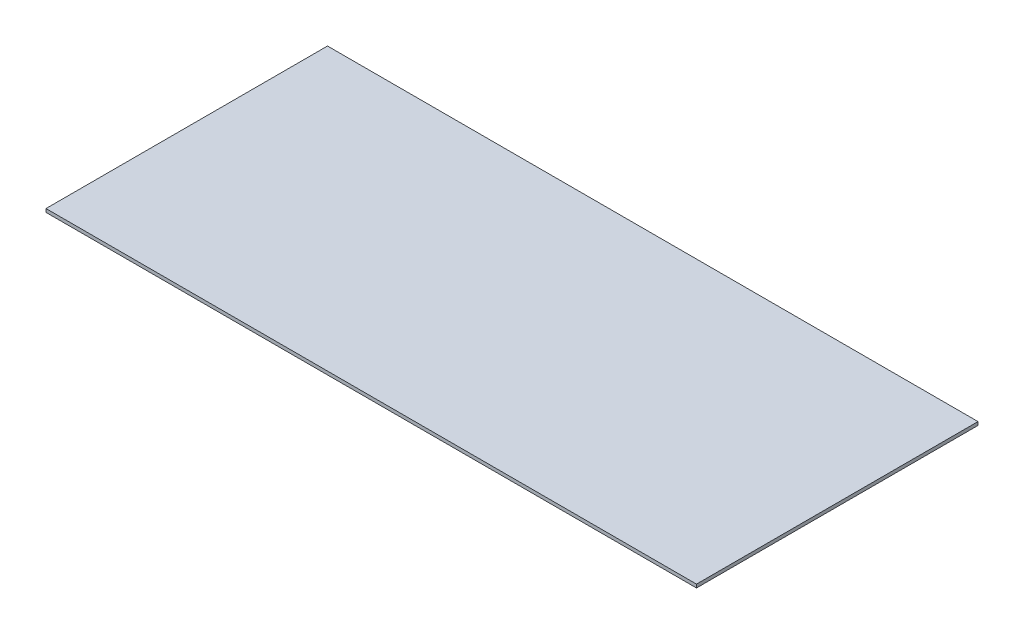
ISO-10303-21;
HEADER;
FILE_DESCRIPTION(('STEP AP214'),'2;1');
FILE_NAME('part.step','',(''),(''),'','','');
FILE_SCHEMA(('AUTOMOTIVE_DESIGN { 1 0 10303 214 1 1 1 1 }'));
ENDSEC;
DATA;
#1=APPLICATION_CONTEXT('core data for automotive mechanical design processes');
#2=APPLICATION_PROTOCOL_DEFINITION('international standard','automotive_design',2000,#1);
#3=PRODUCT_CONTEXT('',#1,'mechanical');
#4=PRODUCT('Part','Part','',(#3));
#5=PRODUCT_RELATED_PRODUCT_CATEGORY('part','',(#4));
#6=PRODUCT_DEFINITION_FORMATION('','',#4);
#7=PRODUCT_DEFINITION_CONTEXT('part definition',#1,'design');
#8=PRODUCT_DEFINITION('design','',#6,#7);
#9=PRODUCT_DEFINITION_SHAPE('','',#8);
#10=(LENGTH_UNIT() NAMED_UNIT(*) SI_UNIT(.MILLI.,.METRE.));
#11=(NAMED_UNIT(*) PLANE_ANGLE_UNIT() SI_UNIT($,.RADIAN.));
#12=(NAMED_UNIT(*) SI_UNIT($,.STERADIAN.) SOLID_ANGLE_UNIT());
#13=UNCERTAINTY_MEASURE_WITH_UNIT(LENGTH_MEASURE(1.E-05),#10,'distance_accuracy_value','');
#14=(GEOMETRIC_REPRESENTATION_CONTEXT(3) GLOBAL_UNCERTAINTY_ASSIGNED_CONTEXT((#13)) GLOBAL_UNIT_ASSIGNED_CONTEXT((#10,
#11,#12)) REPRESENTATION_CONTEXT('',''));
#15=CARTESIAN_POINT('',(0.,0.,0.));
#16=DIRECTION('',(0.,0.,1.));
#17=DIRECTION('',(1.,0.,0.));
#18=AXIS2_PLACEMENT_3D('',#15,#16,#17);
#19=CARTESIAN_POINT('',(1155.4,-0.00999999999999959,0.));
#20=DIRECTION('',(1.,0.,0.));
#21=DIRECTION('',(0.,0.,-1.));
#22=AXIS2_PLACEMENT_3D('',#19,#20,#21);
#23=PLANE('',#22);
#24=DIRECTION('',(0.,-1.,0.));
#25=VECTOR('',#24,1.);
#26=CARTESIAN_POINT('',(1155.4,6.,0.));
#27=LINE('',#26,#25);
#28=CARTESIAN_POINT('',(1155.4,6.,0.));
#29=VERTEX_POINT('',#28);
#30=CARTESIAN_POINT('',(1155.4,0.,0.));
#31=VERTEX_POINT('',#30);
#32=EDGE_CURVE('E86',#29,#31,#27,.T.);
#33=ORIENTED_EDGE('',*,*,#32,.T.);
#34=DIRECTION('',(0.,0.,-1.));
#35=VECTOR('',#34,1.);
#36=CARTESIAN_POINT('',(1155.4,0.,0.));
#37=LINE('',#36,#35);
#38=CARTESIAN_POINT('',(1155.4,0.,-500.));
#39=VERTEX_POINT('',#38);
#40=EDGE_CURVE('E79',#31,#39,#37,.T.);
#41=ORIENTED_EDGE('',*,*,#40,.T.);
#42=DIRECTION('',(0.,-1.,0.));
#43=VECTOR('',#42,1.);
#44=CARTESIAN_POINT('',(1155.4,6.,-500.));
#45=LINE('',#44,#43);
#46=CARTESIAN_POINT('',(1155.4,6.,-500.));
#47=VERTEX_POINT('',#46);
#48=EDGE_CURVE('E82',#47,#39,#45,.T.);
#49=ORIENTED_EDGE('',*,*,#48,.F.);
#50=DIRECTION('',(0.,0.,-1.));
#51=VECTOR('',#50,1.);
#52=CARTESIAN_POINT('',(1155.4,6.,0.));
#53=LINE('',#52,#51);
#54=EDGE_CURVE('E67',#29,#47,#53,.T.);
#55=ORIENTED_EDGE('',*,*,#54,.F.);
#56=EDGE_LOOP('',(#33,#41,#49,#55));
#57=FACE_BOUND('',#56,.T.);
#58=ADVANCED_FACE('F32',(#57),#23,.T.);
#59=CARTESIAN_POINT('',(0.,6.,0.));
#60=DIRECTION('',(0.,1.,0.));
#61=DIRECTION('',(0.,0.,1.));
#62=AXIS2_PLACEMENT_3D('',#59,#60,#61);
#63=PLANE('',#62);
#64=DIRECTION('',(1.,0.,0.));
#65=VECTOR('',#64,1.);
#66=CARTESIAN_POINT('',(0.,6.,0.));
#67=LINE('',#66,#65);
#68=CARTESIAN_POINT('',(0.,6.,0.));
#69=VERTEX_POINT('',#68);
#70=EDGE_CURVE('E93',#69,#29,#67,.T.);
#71=ORIENTED_EDGE('',*,*,#70,.T.);
#72=ORIENTED_EDGE('',*,*,#54,.T.);
#73=DIRECTION('',(1.,0.,0.));
#74=VECTOR('',#73,1.);
#75=CARTESIAN_POINT('',(0.,6.,-500.));
#76=LINE('',#75,#74);
#77=CARTESIAN_POINT('',(0.,6.,-500.));
#78=VERTEX_POINT('',#77);
#79=EDGE_CURVE('E84',#78,#47,#76,.T.);
#80=ORIENTED_EDGE('',*,*,#79,.F.);
#81=DIRECTION('',(0.,0.,-1.));
#82=VECTOR('',#81,1.);
#83=CARTESIAN_POINT('',(0.,6.,0.));
#84=LINE('',#83,#82);
#85=EDGE_CURVE('E95',#69,#78,#84,.T.);
#86=ORIENTED_EDGE('',*,*,#85,.F.);
#87=EDGE_LOOP('',(#71,#72,#80,#86));
#88=FACE_BOUND('',#87,.T.);
#89=ADVANCED_FACE('F105',(#88),#63,.T.);
#90=CARTESIAN_POINT('',(0.,6.,-500.));
#91=DIRECTION('',(0.,0.,-1.));
#92=DIRECTION('',(-1.,0.,0.));
#93=AXIS2_PLACEMENT_3D('',#90,#91,#92);
#94=PLANE('',#93);
#95=ORIENTED_EDGE('',*,*,#79,.T.);
#96=ORIENTED_EDGE('',*,*,#48,.T.);
#97=DIRECTION('',(1.,0.,0.));
#98=VECTOR('',#97,1.);
#99=CARTESIAN_POINT('',(0.,0.,-500.));
#100=LINE('',#99,#98);
#101=CARTESIAN_POINT('',(0.,0.,-500.));
#102=VERTEX_POINT('',#101);
#103=EDGE_CURVE('E11',#102,#39,#100,.T.);
#104=ORIENTED_EDGE('',*,*,#103,.F.);
#105=DIRECTION('',(0.,-1.,0.));
#106=VECTOR('',#105,1.);
#107=CARTESIAN_POINT('',(0.,6.,-500.));
#108=LINE('',#107,#106);
#109=EDGE_CURVE('E60',#78,#102,#108,.T.);
#110=ORIENTED_EDGE('',*,*,#109,.F.);
#111=EDGE_LOOP('',(#95,#96,#104,#110));
#112=FACE_BOUND('',#111,.T.);
#113=ADVANCED_FACE('F83',(#112),#94,.T.);
#114=CARTESIAN_POINT('',(0.,6.,0.));
#115=DIRECTION('',(0.,0.,-1.));
#116=DIRECTION('',(-1.,0.,0.));
#117=AXIS2_PLACEMENT_3D('',#114,#115,#116);
#118=PLANE('',#117);
#119=ORIENTED_EDGE('',*,*,#32,.F.);
#120=ORIENTED_EDGE('',*,*,#70,.F.);
#121=DIRECTION('',(0.,-1.,0.));
#122=VECTOR('',#121,1.);
#123=CARTESIAN_POINT('',(0.,6.,0.));
#124=LINE('',#123,#122);
#125=CARTESIAN_POINT('',(0.,0.,0.));
#126=VERTEX_POINT('',#125);
#127=EDGE_CURVE('E49',#69,#126,#124,.T.);
#128=ORIENTED_EDGE('',*,*,#127,.T.);
#129=DIRECTION('',(1.,0.,0.));
#130=VECTOR('',#129,1.);
#131=CARTESIAN_POINT('',(0.,0.,0.));
#132=LINE('',#131,#130);
#133=EDGE_CURVE('E41',#126,#31,#132,.T.);
#134=ORIENTED_EDGE('',*,*,#133,.T.);
#135=EDGE_LOOP('',(#119,#120,#128,#134));
#136=FACE_BOUND('',#135,.T.);
#137=ADVANCED_FACE('F106',(#136),#118,.F.);
#138=CARTESIAN_POINT('',(0.,0.,0.));
#139=DIRECTION('',(0.,1.,0.));
#140=DIRECTION('',(0.,0.,1.));
#141=AXIS2_PLACEMENT_3D('',#138,#139,#140);
#142=PLANE('',#141);
#143=ORIENTED_EDGE('',*,*,#40,.F.);
#144=ORIENTED_EDGE('',*,*,#133,.F.);
#145=DIRECTION('',(0.,0.,-1.));
#146=VECTOR('',#145,1.);
#147=CARTESIAN_POINT('',(0.,0.,0.));
#148=LINE('',#147,#146);
#149=EDGE_CURVE('E81',#126,#102,#148,.T.);
#150=ORIENTED_EDGE('',*,*,#149,.T.);
#151=ORIENTED_EDGE('',*,*,#103,.T.);
#152=EDGE_LOOP('',(#143,#144,#150,#151));
#153=FACE_BOUND('',#152,.T.);
#154=ADVANCED_FACE('F34',(#153),#142,.F.);
#155=CARTESIAN_POINT('',(0.,6.,0.));
#156=DIRECTION('',(-1.,0.,0.));
#157=DIRECTION('',(0.,0.,1.));
#158=AXIS2_PLACEMENT_3D('',#155,#156,#157);
#159=PLANE('',#158);
#160=ORIENTED_EDGE('',*,*,#149,.F.);
#161=ORIENTED_EDGE('',*,*,#127,.F.);
#162=ORIENTED_EDGE('',*,*,#85,.T.);
#163=ORIENTED_EDGE('',*,*,#109,.T.);
#164=EDGE_LOOP('',(#160,#161,#162,#163));
#165=FACE_BOUND('',#164,.T.);
#166=ADVANCED_FACE('F103',(#165),#159,.T.);
#167=CLOSED_SHELL('',(#58,#89,#113,#137,#154,#166));
#168=MANIFOLD_SOLID_BREP('B2',#167);
#169=ADVANCED_BREP_SHAPE_REPRESENTATION('',(#18,#168),#14);
#170=SHAPE_DEFINITION_REPRESENTATION(#9,#169);
ENDSEC;
END-ISO-10303-21;
